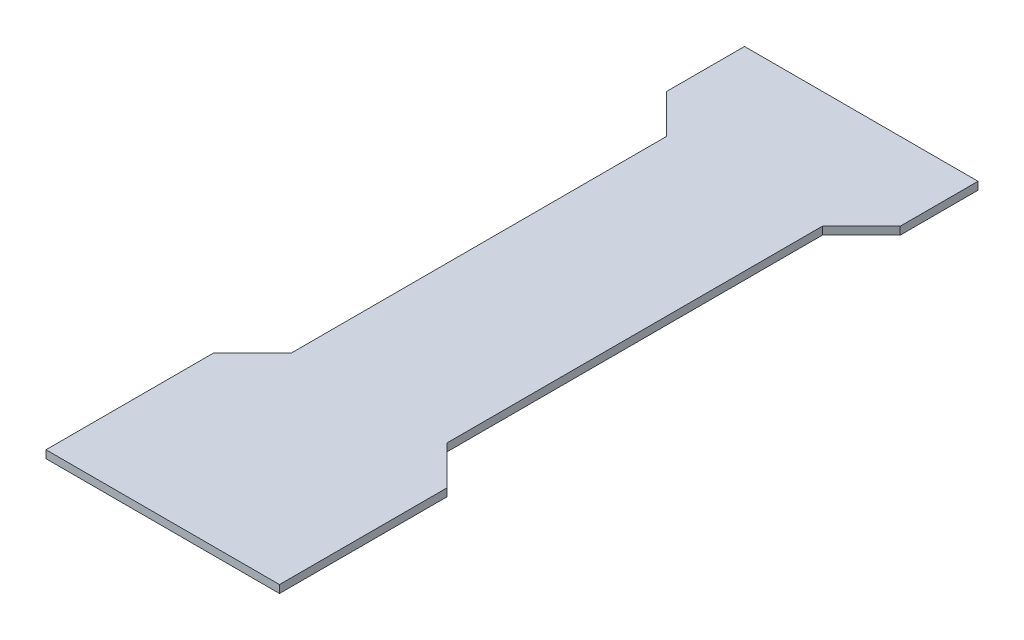
ISO-10303-21;
HEADER;
FILE_DESCRIPTION(('STEP AP214'),'2;1');
FILE_NAME('part.step','',(''),(''),'','','');
FILE_SCHEMA(('AUTOMOTIVE_DESIGN { 1 0 10303 214 1 1 1 1 }'));
ENDSEC;
DATA;
#1=APPLICATION_CONTEXT('core data for automotive mechanical design processes');
#2=APPLICATION_PROTOCOL_DEFINITION('international standard','automotive_design',2000,#1);
#3=PRODUCT_CONTEXT('',#1,'mechanical');
#4=PRODUCT('Part','Part','',(#3));
#5=PRODUCT_RELATED_PRODUCT_CATEGORY('part','',(#4));
#6=PRODUCT_DEFINITION_FORMATION('','',#4);
#7=PRODUCT_DEFINITION_CONTEXT('part definition',#1,'design');
#8=PRODUCT_DEFINITION('design','',#6,#7);
#9=PRODUCT_DEFINITION_SHAPE('','',#8);
#10=(LENGTH_UNIT() NAMED_UNIT(*) SI_UNIT(.MILLI.,.METRE.));
#11=(NAMED_UNIT(*) PLANE_ANGLE_UNIT() SI_UNIT($,.RADIAN.));
#12=(NAMED_UNIT(*) SI_UNIT($,.STERADIAN.) SOLID_ANGLE_UNIT());
#13=UNCERTAINTY_MEASURE_WITH_UNIT(LENGTH_MEASURE(1.E-05),#10,'distance_accuracy_value','');
#14=(GEOMETRIC_REPRESENTATION_CONTEXT(3) GLOBAL_UNCERTAINTY_ASSIGNED_CONTEXT((#13)) GLOBAL_UNIT_ASSIGNED_CONTEXT((#10,
#11,#12)) REPRESENTATION_CONTEXT('',''));
#15=CARTESIAN_POINT('',(0.,0.,0.));
#16=DIRECTION('',(0.,0.,1.));
#17=DIRECTION('',(1.,0.,0.));
#18=AXIS2_PLACEMENT_3D('',#15,#16,#17);
#19=CARTESIAN_POINT('',(30.,2.,0.));
#20=DIRECTION('',(0.,0.,-1.));
#21=DIRECTION('',(-1.,0.,0.));
#22=AXIS2_PLACEMENT_3D('',#19,#20,#21);
#23=PLANE('',#22);
#24=DIRECTION('',(1.,0.,0.));
#25=VECTOR('',#24,1.);
#26=CARTESIAN_POINT('',(30.,0.,0.));
#27=LINE('',#26,#25);
#28=CARTESIAN_POINT('',(-30.,0.,0.));
#29=VERTEX_POINT('',#28);
#30=CARTESIAN_POINT('',(30.,0.,0.));
#31=VERTEX_POINT('',#30);
#32=EDGE_CURVE('E104',#29,#31,#27,.T.);
#33=ORIENTED_EDGE('',*,*,#32,.T.);
#34=DIRECTION('',(0.,-1.,0.));
#35=VECTOR('',#34,1.);
#36=CARTESIAN_POINT('',(30.,2.,0.));
#37=LINE('',#36,#35);
#38=CARTESIAN_POINT('',(30.,2.,0.));
#39=VERTEX_POINT('',#38);
#40=EDGE_CURVE('E11',#39,#31,#37,.T.);
#41=ORIENTED_EDGE('',*,*,#40,.F.);
#42=DIRECTION('',(1.,0.,0.));
#43=VECTOR('',#42,1.);
#44=CARTESIAN_POINT('',(0.,2.,0.));
#45=LINE('',#44,#43);
#46=CARTESIAN_POINT('',(-30.,2.,0.));
#47=VERTEX_POINT('',#46);
#48=EDGE_CURVE('E110',#47,#39,#45,.T.);
#49=ORIENTED_EDGE('',*,*,#48,.F.);
#50=DIRECTION('',(0.,-1.,0.));
#51=VECTOR('',#50,1.);
#52=CARTESIAN_POINT('',(-30.,2.,0.));
#53=LINE('',#52,#51);
#54=EDGE_CURVE('E159',#47,#29,#53,.T.);
#55=ORIENTED_EDGE('',*,*,#54,.T.);
#56=EDGE_LOOP('',(#33,#41,#49,#55));
#57=FACE_BOUND('',#56,.T.);
#58=ADVANCED_FACE('F39',(#57),#23,.F.);
#59=CARTESIAN_POINT('',(30.,2.,-43.));
#60=DIRECTION('',(-1.,0.,0.));
#61=DIRECTION('',(0.,0.,1.));
#62=AXIS2_PLACEMENT_3D('',#59,#60,#61);
#63=PLANE('',#62);
#64=DIRECTION('',(0.,0.,-1.));
#65=VECTOR('',#64,1.);
#66=CARTESIAN_POINT('',(30.,0.,-43.));
#67=LINE('',#66,#65);
#68=CARTESIAN_POINT('',(30.,0.,-43.));
#69=VERTEX_POINT('',#68);
#70=EDGE_CURVE('E165',#31,#69,#67,.T.);
#71=ORIENTED_EDGE('',*,*,#70,.T.);
#72=DIRECTION('',(0.,-1.,0.));
#73=VECTOR('',#72,1.);
#74=CARTESIAN_POINT('',(30.,2.,-43.));
#75=LINE('',#74,#73);
#76=CARTESIAN_POINT('',(30.,2.,-43.));
#77=VERTEX_POINT('',#76);
#78=EDGE_CURVE('E48',#77,#69,#75,.T.);
#79=ORIENTED_EDGE('',*,*,#78,.F.);
#80=DIRECTION('',(0.,0.,-1.));
#81=VECTOR('',#80,1.);
#82=CARTESIAN_POINT('',(30.,2.,-43.));
#83=LINE('',#82,#81);
#84=EDGE_CURVE('E283',#39,#77,#83,.T.);
#85=ORIENTED_EDGE('',*,*,#84,.F.);
#86=ORIENTED_EDGE('',*,*,#40,.T.);
#87=EDGE_LOOP('',(#71,#79,#85,#86));
#88=FACE_BOUND('',#87,.T.);
#89=ADVANCED_FACE('F288',(#88),#63,.F.);
#90=CARTESIAN_POINT('',(30.,2.,-43.));
#91=DIRECTION('',(-0.707106781186547,0.,0.707106781186547));
#92=DIRECTION('',(0.707106781186548,0.,0.707106781186548));
#93=AXIS2_PLACEMENT_3D('',#90,#91,#92);
#94=PLANE('',#93);
#95=DIRECTION('',(-0.707106781186548,0.,-0.707106781186548));
#96=VECTOR('',#95,1.);
#97=CARTESIAN_POINT('',(30.,0.,-43.));
#98=LINE('',#97,#96);
#99=CARTESIAN_POINT('',(20.0000000000001,0.,-52.9999999999999));
#100=VERTEX_POINT('',#99);
#101=EDGE_CURVE('E168',#69,#100,#98,.T.);
#102=ORIENTED_EDGE('',*,*,#101,.T.);
#103=DIRECTION('',(0.,-1.,0.));
#104=VECTOR('',#103,1.);
#105=CARTESIAN_POINT('',(20.0000000000001,2.,-52.9999999999999));
#106=LINE('',#105,#104);
#107=CARTESIAN_POINT('',(20.0000000000001,2.,-52.9999999999999));
#108=VERTEX_POINT('',#107);
#109=EDGE_CURVE('E225',#108,#100,#106,.T.);
#110=ORIENTED_EDGE('',*,*,#109,.F.);
#111=DIRECTION('',(-0.707106781186548,0.,-0.707106781186548));
#112=VECTOR('',#111,1.);
#113=CARTESIAN_POINT('',(30.,2.,-43.));
#114=LINE('',#113,#112);
#115=EDGE_CURVE('E236',#77,#108,#114,.T.);
#116=ORIENTED_EDGE('',*,*,#115,.F.);
#117=ORIENTED_EDGE('',*,*,#78,.T.);
#118=EDGE_LOOP('',(#102,#110,#116,#117));
#119=FACE_BOUND('',#118,.T.);
#120=ADVANCED_FACE('F234',(#119),#94,.F.);
#121=CARTESIAN_POINT('',(20.0000000000001,2.,-149.5));
#122=DIRECTION('',(-1.,0.,0.));
#123=DIRECTION('',(0.,0.,1.));
#124=AXIS2_PLACEMENT_3D('',#121,#122,#123);
#125=PLANE('',#124);
#126=DIRECTION('',(0.,0.,-1.));
#127=VECTOR('',#126,1.);
#128=CARTESIAN_POINT('',(20.0000000000001,0.,-149.5));
#129=LINE('',#128,#127);
#130=CARTESIAN_POINT('',(20.0000000000001,0.,-149.5));
#131=VERTEX_POINT('',#130);
#132=EDGE_CURVE('E172',#100,#131,#129,.T.);
#133=ORIENTED_EDGE('',*,*,#132,.T.);
#134=DIRECTION('',(0.,-1.,0.));
#135=VECTOR('',#134,1.);
#136=CARTESIAN_POINT('',(20.0000000000001,2.,-149.5));
#137=LINE('',#136,#135);
#138=CARTESIAN_POINT('',(20.0000000000001,2.,-149.5));
#139=VERTEX_POINT('',#138);
#140=EDGE_CURVE('E221',#139,#131,#137,.T.);
#141=ORIENTED_EDGE('',*,*,#140,.F.);
#142=DIRECTION('',(0.,0.,-1.));
#143=VECTOR('',#142,1.);
#144=CARTESIAN_POINT('',(20.0000000000001,2.,-139.5));
#145=LINE('',#144,#143);
#146=EDGE_CURVE('E254',#108,#139,#145,.T.);
#147=ORIENTED_EDGE('',*,*,#146,.F.);
#148=ORIENTED_EDGE('',*,*,#109,.T.);
#149=EDGE_LOOP('',(#133,#141,#147,#148));
#150=FACE_BOUND('',#149,.T.);
#151=ADVANCED_FACE('F244',(#150),#125,.F.);
#152=CARTESIAN_POINT('',(30.0000000000002,2.,-159.5));
#153=DIRECTION('',(-0.707106781186548,0.,-0.707106781186547));
#154=DIRECTION('',(-0.707106781186547,0.,0.707106781186548));
#155=AXIS2_PLACEMENT_3D('',#152,#153,#154);
#156=PLANE('',#155);
#157=DIRECTION('',(0.707106781186547,0.,-0.707106781186548));
#158=VECTOR('',#157,1.);
#159=CARTESIAN_POINT('',(30.0000000000002,0.,-159.5));
#160=LINE('',#159,#158);
#161=CARTESIAN_POINT('',(30.0000000000002,0.,-159.5));
#162=VERTEX_POINT('',#161);
#163=EDGE_CURVE('E175',#131,#162,#160,.T.);
#164=ORIENTED_EDGE('',*,*,#163,.T.);
#165=DIRECTION('',(0.,-1.,0.));
#166=VECTOR('',#165,1.);
#167=CARTESIAN_POINT('',(30.0000000000002,2.,-159.5));
#168=LINE('',#167,#166);
#169=CARTESIAN_POINT('',(30.0000000000002,2.,-159.5));
#170=VERTEX_POINT('',#169);
#171=EDGE_CURVE('E217',#170,#162,#168,.T.);
#172=ORIENTED_EDGE('',*,*,#171,.F.);
#173=DIRECTION('',(0.707106781186547,0.,-0.707106781186548));
#174=VECTOR('',#173,1.);
#175=CARTESIAN_POINT('',(30.0000000000002,2.,-159.5));
#176=LINE('',#175,#174);
#177=EDGE_CURVE('E250',#139,#170,#176,.T.);
#178=ORIENTED_EDGE('',*,*,#177,.F.);
#179=ORIENTED_EDGE('',*,*,#140,.T.);
#180=EDGE_LOOP('',(#164,#172,#178,#179));
#181=FACE_BOUND('',#180,.T.);
#182=ADVANCED_FACE('F248',(#181),#156,.F.);
#183=CARTESIAN_POINT('',(30.0000000000002,2.,-159.5));
#184=DIRECTION('',(-1.,0.,0.));
#185=DIRECTION('',(0.,0.,1.));
#186=AXIS2_PLACEMENT_3D('',#183,#184,#185);
#187=PLANE('',#186);
#188=DIRECTION('',(0.,0.,-1.));
#189=VECTOR('',#188,1.);
#190=CARTESIAN_POINT('',(30.0000000000002,0.,-159.5));
#191=LINE('',#190,#189);
#192=CARTESIAN_POINT('',(30.0000000000002,0.,-179.5));
#193=VERTEX_POINT('',#192);
#194=EDGE_CURVE('E178',#162,#193,#191,.T.);
#195=ORIENTED_EDGE('',*,*,#194,.T.);
#196=DIRECTION('',(0.,-1.,0.));
#197=VECTOR('',#196,1.);
#198=CARTESIAN_POINT('',(30.0000000000002,2.,-179.5));
#199=LINE('',#198,#197);
#200=CARTESIAN_POINT('',(30.0000000000002,2.,-179.5));
#201=VERTEX_POINT('',#200);
#202=EDGE_CURVE('E213',#201,#193,#199,.T.);
#203=ORIENTED_EDGE('',*,*,#202,.F.);
#204=DIRECTION('',(0.,0.,-1.));
#205=VECTOR('',#204,1.);
#206=CARTESIAN_POINT('',(30.0000000000002,2.,-159.5));
#207=LINE('',#206,#205);
#208=EDGE_CURVE('E253',#170,#201,#207,.T.);
#209=ORIENTED_EDGE('',*,*,#208,.F.);
#210=ORIENTED_EDGE('',*,*,#171,.T.);
#211=EDGE_LOOP('',(#195,#203,#209,#210));
#212=FACE_BOUND('',#211,.T.);
#213=ADVANCED_FACE('F300',(#212),#187,.F.);
#214=CARTESIAN_POINT('',(-30.0000000000002,2.,-179.5));
#215=DIRECTION('',(0.,0.,1.));
#216=DIRECTION('',(1.,0.,0.));
#217=AXIS2_PLACEMENT_3D('',#214,#215,#216);
#218=PLANE('',#217);
#219=DIRECTION('',(-1.,0.,0.));
#220=VECTOR('',#219,1.);
#221=CARTESIAN_POINT('',(-30.0000000000002,0.,-179.5));
#222=LINE('',#221,#220);
#223=CARTESIAN_POINT('',(-30.0000000000002,0.,-179.5));
#224=VERTEX_POINT('',#223);
#225=EDGE_CURVE('E181',#193,#224,#222,.T.);
#226=ORIENTED_EDGE('',*,*,#225,.T.);
#227=DIRECTION('',(0.,-1.,0.));
#228=VECTOR('',#227,1.);
#229=CARTESIAN_POINT('',(-30.0000000000002,2.,-179.5));
#230=LINE('',#229,#228);
#231=CARTESIAN_POINT('',(-30.0000000000002,2.,-179.5));
#232=VERTEX_POINT('',#231);
#233=EDGE_CURVE('E209',#232,#224,#230,.T.);
#234=ORIENTED_EDGE('',*,*,#233,.F.);
#235=DIRECTION('',(-1.,0.,0.));
#236=VECTOR('',#235,1.);
#237=CARTESIAN_POINT('',(-30.0000000000002,2.,-179.5));
#238=LINE('',#237,#236);
#239=EDGE_CURVE('E258',#201,#232,#238,.T.);
#240=ORIENTED_EDGE('',*,*,#239,.F.);
#241=ORIENTED_EDGE('',*,*,#202,.T.);
#242=EDGE_LOOP('',(#226,#234,#240,#241));
#243=FACE_BOUND('',#242,.T.);
#244=ADVANCED_FACE('F303',(#243),#218,.F.);
#245=CARTESIAN_POINT('',(-30.0000000000002,2.,-159.5));
#246=DIRECTION('',(1.,0.,0.));
#247=DIRECTION('',(0.,0.,-1.));
#248=AXIS2_PLACEMENT_3D('',#245,#246,#247);
#249=PLANE('',#248);
#250=DIRECTION('',(0.,0.,1.));
#251=VECTOR('',#250,1.);
#252=CARTESIAN_POINT('',(-30.0000000000002,0.,-159.5));
#253=LINE('',#252,#251);
#254=CARTESIAN_POINT('',(-30.0000000000002,0.,-159.5));
#255=VERTEX_POINT('',#254);
#256=EDGE_CURVE('E184',#224,#255,#253,.T.);
#257=ORIENTED_EDGE('',*,*,#256,.T.);
#258=DIRECTION('',(0.,-1.,0.));
#259=VECTOR('',#258,1.);
#260=CARTESIAN_POINT('',(-30.0000000000002,2.,-159.5));
#261=LINE('',#260,#259);
#262=CARTESIAN_POINT('',(-30.0000000000002,2.,-159.5));
#263=VERTEX_POINT('',#262);
#264=EDGE_CURVE('E205',#263,#255,#261,.T.);
#265=ORIENTED_EDGE('',*,*,#264,.F.);
#266=DIRECTION('',(0.,0.,1.));
#267=VECTOR('',#266,1.);
#268=CARTESIAN_POINT('',(-30.0000000000002,2.,-159.5));
#269=LINE('',#268,#267);
#270=EDGE_CURVE('E265',#232,#263,#269,.T.);
#271=ORIENTED_EDGE('',*,*,#270,.F.);
#272=ORIENTED_EDGE('',*,*,#233,.T.);
#273=EDGE_LOOP('',(#257,#265,#271,#272));
#274=FACE_BOUND('',#273,.T.);
#275=ADVANCED_FACE('F273',(#274),#249,.F.);
#276=CARTESIAN_POINT('',(-30.0000000000002,2.,-159.5));
#277=DIRECTION('',(0.707106781186547,0.,-0.707106781186548));
#278=DIRECTION('',(-0.707106781186548,0.,-0.707106781186547));
#279=AXIS2_PLACEMENT_3D('',#276,#277,#278);
#280=PLANE('',#279);
#281=DIRECTION('',(0.707106781186548,0.,0.707106781186547));
#282=VECTOR('',#281,1.);
#283=CARTESIAN_POINT('',(-30.0000000000002,0.,-159.5));
#284=LINE('',#283,#282);
#285=CARTESIAN_POINT('',(-20.0000000000001,0.,-149.5));
#286=VERTEX_POINT('',#285);
#287=EDGE_CURVE('E187',#255,#286,#284,.T.);
#288=ORIENTED_EDGE('',*,*,#287,.T.);
#289=DIRECTION('',(0.,-1.,0.));
#290=VECTOR('',#289,1.);
#291=CARTESIAN_POINT('',(-20.0000000000001,2.,-149.5));
#292=LINE('',#291,#290);
#293=CARTESIAN_POINT('',(-20.0000000000001,2.,-149.5));
#294=VERTEX_POINT('',#293);
#295=EDGE_CURVE('E152',#294,#286,#292,.T.);
#296=ORIENTED_EDGE('',*,*,#295,.F.);
#297=DIRECTION('',(0.707106781186548,0.,0.707106781186547));
#298=VECTOR('',#297,1.);
#299=CARTESIAN_POINT('',(-30.0000000000002,2.,-159.5));
#300=LINE('',#299,#298);
#301=EDGE_CURVE('E142',#263,#294,#300,.T.);
#302=ORIENTED_EDGE('',*,*,#301,.F.);
#303=ORIENTED_EDGE('',*,*,#264,.T.);
#304=EDGE_LOOP('',(#288,#296,#302,#303));
#305=FACE_BOUND('',#304,.T.);
#306=ADVANCED_FACE('F277',(#305),#280,.F.);
#307=CARTESIAN_POINT('',(-20.0000000000001,2.,-139.5));
#308=DIRECTION('',(1.,0.,0.));
#309=DIRECTION('',(0.,0.,-1.));
#310=AXIS2_PLACEMENT_3D('',#307,#308,#309);
#311=PLANE('',#310);
#312=DIRECTION('',(0.,0.,1.));
#313=VECTOR('',#312,1.);
#314=CARTESIAN_POINT('',(-20.0000000000001,0.,-139.5));
#315=LINE('',#314,#313);
#316=CARTESIAN_POINT('',(-20.0000000000001,0.,-52.9999999999998));
#317=VERTEX_POINT('',#316);
#318=EDGE_CURVE('E150',#286,#317,#315,.T.);
#319=ORIENTED_EDGE('',*,*,#318,.T.);
#320=DIRECTION('',(0.,-1.,0.));
#321=VECTOR('',#320,1.);
#322=CARTESIAN_POINT('',(-20.0000000000001,2.,-52.9999999999998));
#323=LINE('',#322,#321);
#324=CARTESIAN_POINT('',(-20.0000000000001,2.,-52.9999999999998));
#325=VERTEX_POINT('',#324);
#326=EDGE_CURVE('E148',#325,#317,#323,.T.);
#327=ORIENTED_EDGE('',*,*,#326,.F.);
#328=DIRECTION('',(0.,0.,1.));
#329=VECTOR('',#328,1.);
#330=CARTESIAN_POINT('',(-20.0000000000001,2.,-149.5));
#331=LINE('',#330,#329);
#332=EDGE_CURVE('E136',#294,#325,#331,.T.);
#333=ORIENTED_EDGE('',*,*,#332,.F.);
#334=ORIENTED_EDGE('',*,*,#295,.T.);
#335=EDGE_LOOP('',(#319,#327,#333,#334));
#336=FACE_BOUND('',#335,.T.);
#337=ADVANCED_FACE('F149',(#336),#311,.F.);
#338=CARTESIAN_POINT('',(-30.,2.,-43.));
#339=DIRECTION('',(0.707106781186547,0.,0.707106781186547));
#340=DIRECTION('',(0.707106781186548,0.,-0.707106781186548));
#341=AXIS2_PLACEMENT_3D('',#338,#339,#340);
#342=PLANE('',#341);
#343=DIRECTION('',(-0.707106781186548,0.,0.707106781186548));
#344=VECTOR('',#343,1.);
#345=CARTESIAN_POINT('',(-30.,0.,-43.));
#346=LINE('',#345,#344);
#347=CARTESIAN_POINT('',(-30.,0.,-43.));
#348=VERTEX_POINT('',#347);
#349=EDGE_CURVE('E97',#317,#348,#346,.T.);
#350=ORIENTED_EDGE('',*,*,#349,.T.);
#351=DIRECTION('',(0.,-1.,0.));
#352=VECTOR('',#351,1.);
#353=CARTESIAN_POINT('',(-30.,2.,-43.));
#354=LINE('',#353,#352);
#355=CARTESIAN_POINT('',(-30.,2.,-43.));
#356=VERTEX_POINT('',#355);
#357=EDGE_CURVE('E153',#356,#348,#354,.T.);
#358=ORIENTED_EDGE('',*,*,#357,.F.);
#359=DIRECTION('',(-0.707106781186548,0.,0.707106781186548));
#360=VECTOR('',#359,1.);
#361=CARTESIAN_POINT('',(-30.,2.,-43.));
#362=LINE('',#361,#360);
#363=EDGE_CURVE('E140',#325,#356,#362,.T.);
#364=ORIENTED_EDGE('',*,*,#363,.F.);
#365=ORIENTED_EDGE('',*,*,#326,.T.);
#366=EDGE_LOOP('',(#350,#358,#364,#365));
#367=FACE_BOUND('',#366,.T.);
#368=ADVANCED_FACE('F155',(#367),#342,.F.);
#369=CARTESIAN_POINT('',(-30.,2.,0.));
#370=DIRECTION('',(1.,0.,0.));
#371=DIRECTION('',(0.,0.,-1.));
#372=AXIS2_PLACEMENT_3D('',#369,#370,#371);
#373=PLANE('',#372);
#374=DIRECTION('',(0.,0.,1.));
#375=VECTOR('',#374,1.);
#376=CARTESIAN_POINT('',(-30.,0.,0.));
#377=LINE('',#376,#375);
#378=EDGE_CURVE('E195',#348,#29,#377,.T.);
#379=ORIENTED_EDGE('',*,*,#378,.T.);
#380=ORIENTED_EDGE('',*,*,#54,.F.);
#381=DIRECTION('',(0.,0.,1.));
#382=VECTOR('',#381,1.);
#383=CARTESIAN_POINT('',(-30.,2.,0.));
#384=LINE('',#383,#382);
#385=EDGE_CURVE('E56',#356,#47,#384,.T.);
#386=ORIENTED_EDGE('',*,*,#385,.F.);
#387=ORIENTED_EDGE('',*,*,#357,.T.);
#388=EDGE_LOOP('',(#379,#380,#386,#387));
#389=FACE_BOUND('',#388,.T.);
#390=ADVANCED_FACE('F280',(#389),#373,.F.);
#391=CARTESIAN_POINT('',(0.,2.,0.));
#392=DIRECTION('',(0.,-1.,0.));
#393=DIRECTION('',(0.,0.,-1.));
#394=AXIS2_PLACEMENT_3D('',#391,#392,#393);
#395=PLANE('',#394);
#396=ORIENTED_EDGE('',*,*,#48,.T.);
#397=ORIENTED_EDGE('',*,*,#84,.T.);
#398=ORIENTED_EDGE('',*,*,#115,.T.);
#399=ORIENTED_EDGE('',*,*,#146,.T.);
#400=ORIENTED_EDGE('',*,*,#177,.T.);
#401=ORIENTED_EDGE('',*,*,#208,.T.);
#402=ORIENTED_EDGE('',*,*,#239,.T.);
#403=ORIENTED_EDGE('',*,*,#270,.T.);
#404=ORIENTED_EDGE('',*,*,#301,.T.);
#405=ORIENTED_EDGE('',*,*,#332,.T.);
#406=ORIENTED_EDGE('',*,*,#363,.T.);
#407=ORIENTED_EDGE('',*,*,#385,.T.);
#408=EDGE_LOOP('',(#396,#397,#398,#399,#400,#401,#402,#403,#404,#405,#406,#407));
#409=FACE_BOUND('',#408,.T.);
#410=ADVANCED_FACE('F138',(#409),#395,.F.);
#411=CARTESIAN_POINT('',(0.,0.,0.));
#412=DIRECTION('',(0.,-1.,0.));
#413=DIRECTION('',(0.,0.,-1.));
#414=AXIS2_PLACEMENT_3D('',#411,#412,#413);
#415=PLANE('',#414);
#416=ORIENTED_EDGE('',*,*,#32,.F.);
#417=ORIENTED_EDGE('',*,*,#378,.F.);
#418=ORIENTED_EDGE('',*,*,#349,.F.);
#419=ORIENTED_EDGE('',*,*,#318,.F.);
#420=ORIENTED_EDGE('',*,*,#287,.F.);
#421=ORIENTED_EDGE('',*,*,#256,.F.);
#422=ORIENTED_EDGE('',*,*,#225,.F.);
#423=ORIENTED_EDGE('',*,*,#194,.F.);
#424=ORIENTED_EDGE('',*,*,#163,.F.);
#425=ORIENTED_EDGE('',*,*,#132,.F.);
#426=ORIENTED_EDGE('',*,*,#101,.F.);
#427=ORIENTED_EDGE('',*,*,#70,.F.);
#428=EDGE_LOOP('',(#416,#417,#418,#419,#420,#421,#422,#423,#424,#425,#426,#427));
#429=FACE_BOUND('',#428,.T.);
#430=ADVANCED_FACE('F239',(#429),#415,.T.);
#431=CLOSED_SHELL('',(#58,#89,#120,#151,#182,#213,#244,#275,#306,#337,#368,#390,#410,#430));
#432=MANIFOLD_SOLID_BREP('B2',#431);
#433=ADVANCED_BREP_SHAPE_REPRESENTATION('',(#18,#432),#14);
#434=SHAPE_DEFINITION_REPRESENTATION(#9,#433);
ENDSEC;
END-ISO-10303-21;
